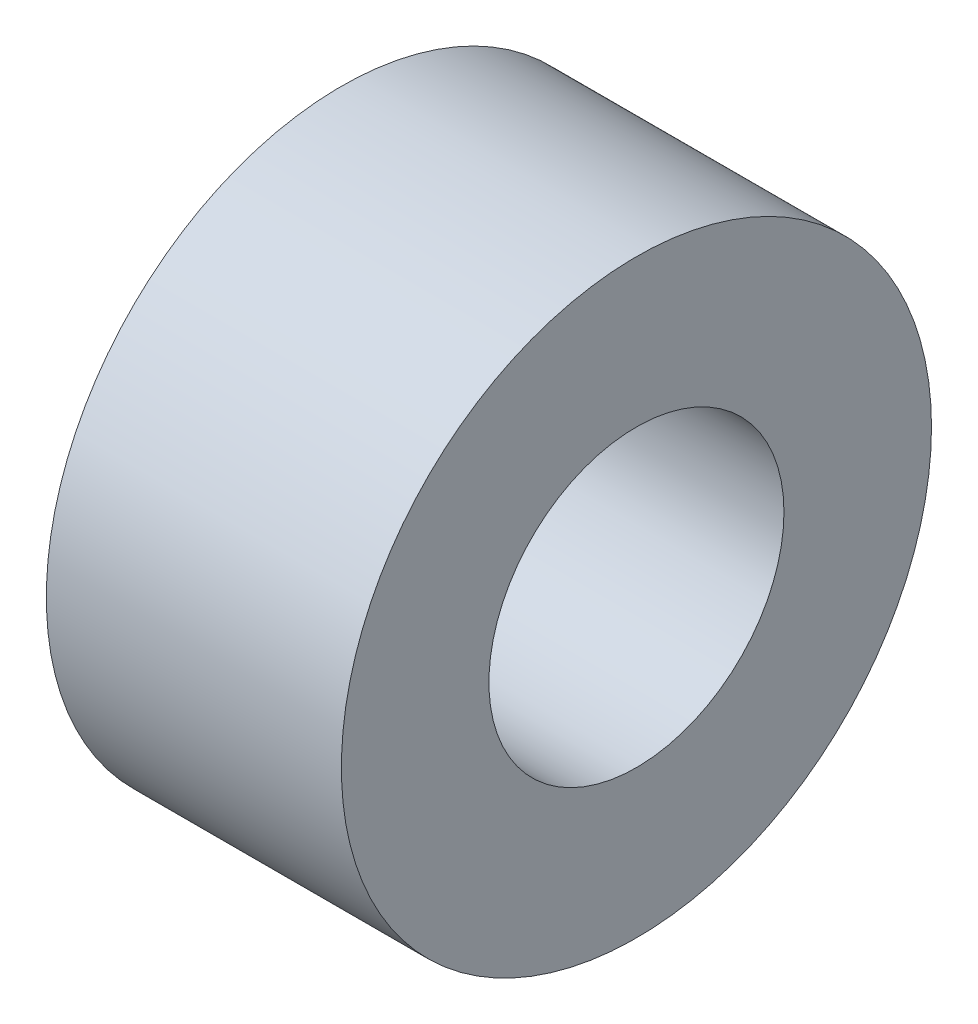
ISO-10303-21;
HEADER;
FILE_DESCRIPTION(('STEP AP214'),'2;1');
FILE_NAME('part.step','',(''),(''),'','','');
FILE_SCHEMA(('AUTOMOTIVE_DESIGN { 1 0 10303 214 1 1 1 1 }'));
ENDSEC;
DATA;
#1=APPLICATION_CONTEXT('core data for automotive mechanical design processes');
#2=APPLICATION_PROTOCOL_DEFINITION('international standard','automotive_design',2000,#1);
#3=PRODUCT_CONTEXT('',#1,'mechanical');
#4=PRODUCT('Part','Part','',(#3));
#5=PRODUCT_RELATED_PRODUCT_CATEGORY('part','',(#4));
#6=PRODUCT_DEFINITION_FORMATION('','',#4);
#7=PRODUCT_DEFINITION_CONTEXT('part definition',#1,'design');
#8=PRODUCT_DEFINITION('design','',#6,#7);
#9=PRODUCT_DEFINITION_SHAPE('','',#8);
#10=(LENGTH_UNIT() NAMED_UNIT(*) SI_UNIT(.MILLI.,.METRE.));
#11=(NAMED_UNIT(*) PLANE_ANGLE_UNIT() SI_UNIT($,.RADIAN.));
#12=(NAMED_UNIT(*) SI_UNIT($,.STERADIAN.) SOLID_ANGLE_UNIT());
#13=UNCERTAINTY_MEASURE_WITH_UNIT(LENGTH_MEASURE(1.E-05),#10,'distance_accuracy_value','');
#14=(GEOMETRIC_REPRESENTATION_CONTEXT(3) GLOBAL_UNCERTAINTY_ASSIGNED_CONTEXT((#13)) GLOBAL_UNIT_ASSIGNED_CONTEXT((#10,
#11,#12)) REPRESENTATION_CONTEXT('',''));
#15=CARTESIAN_POINT('',(0.,0.,0.));
#16=DIRECTION('',(0.,0.,1.));
#17=DIRECTION('',(1.,0.,0.));
#18=AXIS2_PLACEMENT_3D('',#15,#16,#17);
#19=CARTESIAN_POINT('',(-2.5,0.,0.));
#20=DIRECTION('',(1.,0.,0.));
#21=DIRECTION('',(0.,0.,-1.));
#22=AXIS2_PLACEMENT_3D('',#19,#20,#21);
#23=CYLINDRICAL_SURFACE('',#22,5.);
#24=CARTESIAN_POINT('',(-2.5,0.,0.));
#25=DIRECTION('',(1.,0.,0.));
#26=DIRECTION('',(0.,0.,-1.));
#27=AXIS2_PLACEMENT_3D('',#24,#25,#26);
#28=CIRCLE('',#27,5.);
#29=CARTESIAN_POINT('',(-2.5,0.,-5.));
#30=VERTEX_POINT('',#29);
#31=EDGE_CURVE('E10',#30,#30,#28,.T.);
#32=ORIENTED_EDGE('',*,*,#31,.T.);
#33=EDGE_LOOP('',(#32));
#34=FACE_BOUND('',#33,.T.);
#35=CARTESIAN_POINT('',(2.5,0.,0.));
#36=DIRECTION('',(1.,0.,0.));
#37=DIRECTION('',(0.,0.,-1.));
#38=AXIS2_PLACEMENT_3D('',#35,#36,#37);
#39=CIRCLE('',#38,5.);
#40=CARTESIAN_POINT('',(2.5,0.,-5.));
#41=VERTEX_POINT('',#40);
#42=EDGE_CURVE('E36',#41,#41,#39,.T.);
#43=ORIENTED_EDGE('',*,*,#42,.F.);
#44=EDGE_LOOP('',(#43));
#45=FACE_BOUND('',#44,.T.);
#46=ADVANCED_FACE('F30',(#34,#45),#23,.T.);
#47=CARTESIAN_POINT('',(-2.5,0.,0.));
#48=DIRECTION('',(1.,0.,0.));
#49=DIRECTION('',(0.,0.,-1.));
#50=AXIS2_PLACEMENT_3D('',#47,#48,#49);
#51=PLANE('',#50);
#52=CARTESIAN_POINT('',(-2.5,0.,0.));
#53=DIRECTION('',(1.,0.,0.));
#54=DIRECTION('',(0.,0.,-1.));
#55=AXIS2_PLACEMENT_3D('',#52,#53,#54);
#56=CIRCLE('',#55,2.5);
#57=CARTESIAN_POINT('',(-2.5,0.,-2.5));
#58=VERTEX_POINT('',#57);
#59=EDGE_CURVE('E40',#58,#58,#56,.T.);
#60=ORIENTED_EDGE('',*,*,#59,.T.);
#61=EDGE_LOOP('',(#60));
#62=FACE_BOUND('',#61,.T.);
#63=ORIENTED_EDGE('',*,*,#31,.F.);
#64=EDGE_LOOP('',(#63));
#65=FACE_BOUND('',#64,.T.);
#66=ADVANCED_FACE('F54',(#62,#65),#51,.F.);
#67=CARTESIAN_POINT('',(2.5,0.,0.));
#68=DIRECTION('',(1.,0.,0.));
#69=DIRECTION('',(0.,0.,-1.));
#70=AXIS2_PLACEMENT_3D('',#67,#68,#69);
#71=PLANE('',#70);
#72=CARTESIAN_POINT('',(2.5,0.,0.));
#73=DIRECTION('',(1.,0.,0.));
#74=DIRECTION('',(0.,0.,-1.));
#75=AXIS2_PLACEMENT_3D('',#72,#73,#74);
#76=CIRCLE('',#75,2.5);
#77=CARTESIAN_POINT('',(2.5,0.,-2.5));
#78=VERTEX_POINT('',#77);
#79=EDGE_CURVE('E44',#78,#78,#76,.T.);
#80=ORIENTED_EDGE('',*,*,#79,.F.);
#81=EDGE_LOOP('',(#80));
#82=FACE_BOUND('',#81,.T.);
#83=ORIENTED_EDGE('',*,*,#42,.T.);
#84=EDGE_LOOP('',(#83));
#85=FACE_BOUND('',#84,.T.);
#86=ADVANCED_FACE('F52',(#82,#85),#71,.T.);
#87=CARTESIAN_POINT('',(-2.5,0.,0.));
#88=DIRECTION('',(1.,0.,0.));
#89=DIRECTION('',(0.,0.,-1.));
#90=AXIS2_PLACEMENT_3D('',#87,#88,#89);
#91=CYLINDRICAL_SURFACE('',#90,2.5);
#92=ORIENTED_EDGE('',*,*,#59,.F.);
#93=EDGE_LOOP('',(#92));
#94=FACE_BOUND('',#93,.T.);
#95=ORIENTED_EDGE('',*,*,#79,.T.);
#96=EDGE_LOOP('',(#95));
#97=FACE_BOUND('',#96,.T.);
#98=ADVANCED_FACE('F50',(#94,#97),#91,.F.);
#99=CLOSED_SHELL('',(#46,#66,#86,#98));
#100=MANIFOLD_SOLID_BREP('B2',#99);
#101=ADVANCED_BREP_SHAPE_REPRESENTATION('',(#18,#100),#14);
#102=SHAPE_DEFINITION_REPRESENTATION(#9,#101);
ENDSEC;
END-ISO-10303-21;
